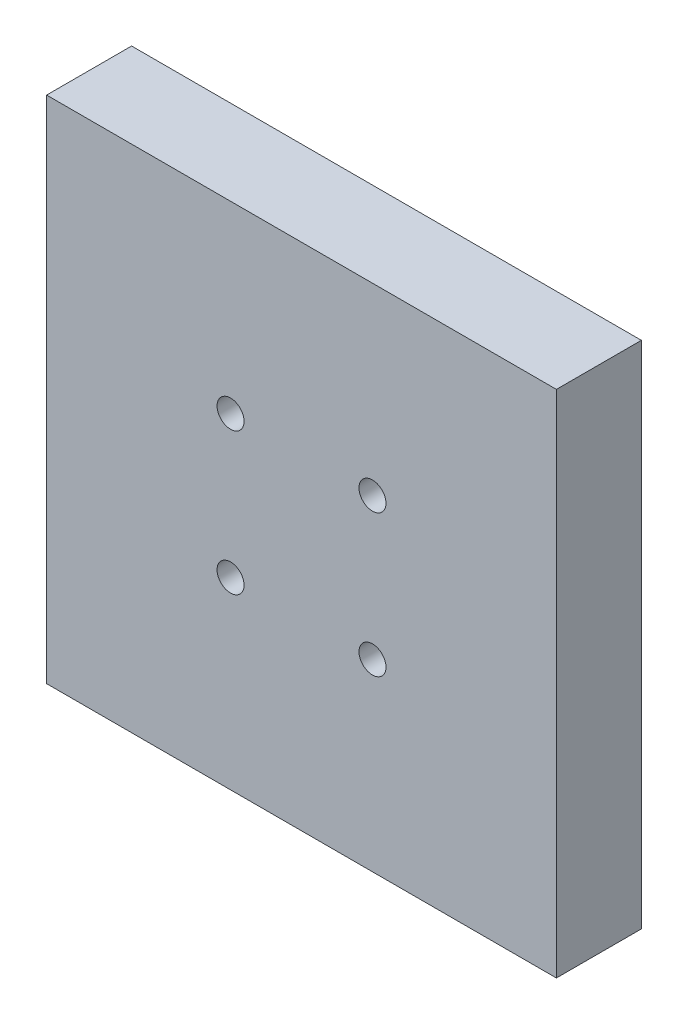
ISO-10303-21;
HEADER;
FILE_DESCRIPTION(('STEP AP214'),'2;1');
FILE_NAME('part.step','',(''),(''),'','','');
FILE_SCHEMA(('AUTOMOTIVE_DESIGN { 1 0 10303 214 1 1 1 1 }'));
ENDSEC;
DATA;
#1=APPLICATION_CONTEXT('core data for automotive mechanical design processes');
#2=APPLICATION_PROTOCOL_DEFINITION('international standard','automotive_design',2000,#1);
#3=PRODUCT_CONTEXT('',#1,'mechanical');
#4=PRODUCT('Part','Part','',(#3));
#5=PRODUCT_RELATED_PRODUCT_CATEGORY('part','',(#4));
#6=PRODUCT_DEFINITION_FORMATION('','',#4);
#7=PRODUCT_DEFINITION_CONTEXT('part definition',#1,'design');
#8=PRODUCT_DEFINITION('design','',#6,#7);
#9=PRODUCT_DEFINITION_SHAPE('','',#8);
#10=(LENGTH_UNIT() NAMED_UNIT(*) SI_UNIT(.MILLI.,.METRE.));
#11=(NAMED_UNIT(*) PLANE_ANGLE_UNIT() SI_UNIT($,.RADIAN.));
#12=(NAMED_UNIT(*) SI_UNIT($,.STERADIAN.) SOLID_ANGLE_UNIT());
#13=UNCERTAINTY_MEASURE_WITH_UNIT(LENGTH_MEASURE(1.E-05),#10,'distance_accuracy_value','');
#14=(GEOMETRIC_REPRESENTATION_CONTEXT(3) GLOBAL_UNCERTAINTY_ASSIGNED_CONTEXT((#13)) GLOBAL_UNIT_ASSIGNED_CONTEXT((#10,
#11,#12)) REPRESENTATION_CONTEXT('',''));
#15=CARTESIAN_POINT('',(0.,0.,0.));
#16=DIRECTION('',(0.,0.,1.));
#17=DIRECTION('',(1.,0.,0.));
#18=AXIS2_PLACEMENT_3D('',#15,#16,#17);
#19=CARTESIAN_POINT('',(0.,0.,12.7));
#20=DIRECTION('',(0.,0.,1.));
#21=DIRECTION('',(1.,0.,0.));
#22=AXIS2_PLACEMENT_3D('',#19,#20,#21);
#23=PLANE('',#22);
#24=CARTESIAN_POINT('',(10.6066017177982,-10.6066017177982,12.7));
#25=DIRECTION('',(0.,0.,-1.));
#26=DIRECTION('',(-1.,0.,0.));
#27=AXIS2_PLACEMENT_3D('',#24,#25,#26);
#28=CIRCLE('',#27,2.0193);
#29=CARTESIAN_POINT('',(8.58730171779821,-10.6066017177982,12.7));
#30=VERTEX_POINT('',#29);
#31=EDGE_CURVE('E147',#30,#30,#28,.T.);
#32=ORIENTED_EDGE('',*,*,#31,.T.);
#33=EDGE_LOOP('',(#32));
#34=FACE_BOUND('',#33,.T.);
#35=CARTESIAN_POINT('',(-10.6066017177982,10.6066017177982,12.7));
#36=DIRECTION('',(0.,0.,-1.));
#37=DIRECTION('',(-1.,0.,0.));
#38=AXIS2_PLACEMENT_3D('',#35,#36,#37);
#39=CIRCLE('',#38,2.0193);
#40=CARTESIAN_POINT('',(-12.6259017177982,10.6066017177982,12.7));
#41=VERTEX_POINT('',#40);
#42=EDGE_CURVE('E127',#41,#41,#39,.T.);
#43=ORIENTED_EDGE('',*,*,#42,.T.);
#44=EDGE_LOOP('',(#43));
#45=FACE_BOUND('',#44,.T.);
#46=DIRECTION('',(1.,0.,0.));
#47=VECTOR('',#46,1.);
#48=CARTESIAN_POINT('',(0.,-38.1,12.7));
#49=LINE('',#48,#47);
#50=CARTESIAN_POINT('',(-38.1,-38.1,12.7));
#51=VERTEX_POINT('',#50);
#52=CARTESIAN_POINT('',(38.1,-38.1,12.7));
#53=VERTEX_POINT('',#52);
#54=EDGE_CURVE('E90',#51,#53,#49,.T.);
#55=ORIENTED_EDGE('',*,*,#54,.T.);
#56=DIRECTION('',(0.,1.,0.));
#57=VECTOR('',#56,1.);
#58=CARTESIAN_POINT('',(38.1,0.,12.7));
#59=LINE('',#58,#57);
#60=CARTESIAN_POINT('',(38.1,38.1,12.7));
#61=VERTEX_POINT('',#60);
#62=EDGE_CURVE('E82',#53,#61,#59,.T.);
#63=ORIENTED_EDGE('',*,*,#62,.T.);
#64=DIRECTION('',(1.,0.,0.));
#65=VECTOR('',#64,1.);
#66=CARTESIAN_POINT('',(0.,38.1,12.7));
#67=LINE('',#66,#65);
#68=CARTESIAN_POINT('',(-38.1,38.1,12.7));
#69=VERTEX_POINT('',#68);
#70=EDGE_CURVE('E89',#69,#61,#67,.T.);
#71=ORIENTED_EDGE('',*,*,#70,.F.);
#72=DIRECTION('',(0.,1.,0.));
#73=VECTOR('',#72,1.);
#74=CARTESIAN_POINT('',(-38.1,0.,12.7));
#75=LINE('',#74,#73);
#76=EDGE_CURVE('E102',#51,#69,#75,.T.);
#77=ORIENTED_EDGE('',*,*,#76,.F.);
#78=EDGE_LOOP('',(#55,#63,#71,#77));
#79=FACE_BOUND('',#78,.T.);
#80=CARTESIAN_POINT('',(10.6066017177982,10.6066017177982,12.7));
#81=DIRECTION('',(0.,0.,1.));
#82=DIRECTION('',(1.,0.,0.));
#83=AXIS2_PLACEMENT_3D('',#80,#81,#82);
#84=CIRCLE('',#83,2.0193);
#85=CARTESIAN_POINT('',(12.6259017177982,10.6066017177982,12.7));
#86=VERTEX_POINT('',#85);
#87=EDGE_CURVE('E131',#86,#86,#84,.T.);
#88=ORIENTED_EDGE('',*,*,#87,.F.);
#89=EDGE_LOOP('',(#88));
#90=FACE_BOUND('',#89,.T.);
#91=CARTESIAN_POINT('',(-10.6066017177982,-10.6066017177982,12.7));
#92=DIRECTION('',(0.,0.,1.));
#93=DIRECTION('',(1.,0.,0.));
#94=AXIS2_PLACEMENT_3D('',#91,#92,#93);
#95=CIRCLE('',#94,2.0193);
#96=CARTESIAN_POINT('',(-8.58730171779822,-10.6066017177982,12.7));
#97=VERTEX_POINT('',#96);
#98=EDGE_CURVE('E139',#97,#97,#95,.T.);
#99=ORIENTED_EDGE('',*,*,#98,.F.);
#100=EDGE_LOOP('',(#99));
#101=FACE_BOUND('',#100,.T.);
#102=ADVANCED_FACE('F39',(#34,#45,#79,#90,#101),#23,.T.);
#103=CARTESIAN_POINT('',(0.,0.,0.));
#104=DIRECTION('',(0.,0.,1.));
#105=DIRECTION('',(1.,0.,0.));
#106=AXIS2_PLACEMENT_3D('',#103,#104,#105);
#107=PLANE('',#106);
#108=CARTESIAN_POINT('',(10.6066017177982,10.6066017177982,0.));
#109=DIRECTION('',(0.,0.,1.));
#110=DIRECTION('',(1.,0.,0.));
#111=AXIS2_PLACEMENT_3D('',#108,#109,#110);
#112=CIRCLE('',#111,2.0193);
#113=CARTESIAN_POINT('',(12.6259017177982,10.6066017177982,0.));
#114=VERTEX_POINT('',#113);
#115=EDGE_CURVE('E151',#114,#114,#112,.T.);
#116=ORIENTED_EDGE('',*,*,#115,.T.);
#117=EDGE_LOOP('',(#116));
#118=FACE_BOUND('',#117,.T.);
#119=CARTESIAN_POINT('',(-10.6066017177982,10.6066017177982,0.));
#120=DIRECTION('',(0.,0.,-1.));
#121=DIRECTION('',(-1.,0.,0.));
#122=AXIS2_PLACEMENT_3D('',#119,#120,#121);
#123=CIRCLE('',#122,2.0193);
#124=CARTESIAN_POINT('',(-12.6259017177982,10.6066017177982,0.));
#125=VERTEX_POINT('',#124);
#126=EDGE_CURVE('E111',#125,#125,#123,.T.);
#127=ORIENTED_EDGE('',*,*,#126,.F.);
#128=EDGE_LOOP('',(#127));
#129=FACE_BOUND('',#128,.T.);
#130=DIRECTION('',(1.,0.,0.));
#131=VECTOR('',#130,1.);
#132=CARTESIAN_POINT('',(0.,-38.1,0.));
#133=LINE('',#132,#131);
#134=CARTESIAN_POINT('',(-38.1,-38.1,0.));
#135=VERTEX_POINT('',#134);
#136=CARTESIAN_POINT('',(38.1,-38.1,0.));
#137=VERTEX_POINT('',#136);
#138=EDGE_CURVE('E108',#135,#137,#133,.T.);
#139=ORIENTED_EDGE('',*,*,#138,.F.);
#140=DIRECTION('',(0.,1.,0.));
#141=VECTOR('',#140,1.);
#142=CARTESIAN_POINT('',(-38.1,0.,0.));
#143=LINE('',#142,#141);
#144=CARTESIAN_POINT('',(-38.1,38.1,0.));
#145=VERTEX_POINT('',#144);
#146=EDGE_CURVE('E117',#135,#145,#143,.T.);
#147=ORIENTED_EDGE('',*,*,#146,.T.);
#148=DIRECTION('',(1.,0.,0.));
#149=VECTOR('',#148,1.);
#150=CARTESIAN_POINT('',(0.,38.1,0.));
#151=LINE('',#150,#149);
#152=CARTESIAN_POINT('',(38.1,38.1,0.));
#153=VERTEX_POINT('',#152);
#154=EDGE_CURVE('E114',#145,#153,#151,.T.);
#155=ORIENTED_EDGE('',*,*,#154,.T.);
#156=DIRECTION('',(0.,1.,0.));
#157=VECTOR('',#156,1.);
#158=CARTESIAN_POINT('',(38.1,0.,0.));
#159=LINE('',#158,#157);
#160=EDGE_CURVE('E96',#137,#153,#159,.T.);
#161=ORIENTED_EDGE('',*,*,#160,.F.);
#162=EDGE_LOOP('',(#139,#147,#155,#161));
#163=FACE_BOUND('',#162,.T.);
#164=CARTESIAN_POINT('',(10.6066017177982,-10.6066017177982,0.));
#165=DIRECTION('',(0.,0.,-1.));
#166=DIRECTION('',(-1.,0.,0.));
#167=AXIS2_PLACEMENT_3D('',#164,#165,#166);
#168=CIRCLE('',#167,2.0193);
#169=CARTESIAN_POINT('',(8.58730171779821,-10.6066017177982,0.));
#170=VERTEX_POINT('',#169);
#171=EDGE_CURVE('E143',#170,#170,#168,.T.);
#172=ORIENTED_EDGE('',*,*,#171,.F.);
#173=EDGE_LOOP('',(#172));
#174=FACE_BOUND('',#173,.T.);
#175=CARTESIAN_POINT('',(-10.6066017177982,-10.6066017177982,0.));
#176=DIRECTION('',(0.,0.,1.));
#177=DIRECTION('',(1.,0.,0.));
#178=AXIS2_PLACEMENT_3D('',#175,#176,#177);
#179=CIRCLE('',#178,2.0193);
#180=CARTESIAN_POINT('',(-8.58730171779822,-10.6066017177982,0.));
#181=VERTEX_POINT('',#180);
#182=EDGE_CURVE('E135',#181,#181,#179,.T.);
#183=ORIENTED_EDGE('',*,*,#182,.T.);
#184=EDGE_LOOP('',(#183));
#185=FACE_BOUND('',#184,.T.);
#186=ADVANCED_FACE('F162',(#118,#129,#163,#174,#185),#107,.F.);
#187=CARTESIAN_POINT('',(0.,-38.1,12.7));
#188=DIRECTION('',(0.,1.,0.));
#189=DIRECTION('',(0.,0.,1.));
#190=AXIS2_PLACEMENT_3D('',#187,#188,#189);
#191=PLANE('',#190);
#192=ORIENTED_EDGE('',*,*,#138,.T.);
#193=DIRECTION('',(0.,0.,-1.));
#194=VECTOR('',#193,1.);
#195=CARTESIAN_POINT('',(38.1,-38.1,12.7));
#196=LINE('',#195,#194);
#197=EDGE_CURVE('E11',#53,#137,#196,.T.);
#198=ORIENTED_EDGE('',*,*,#197,.F.);
#199=ORIENTED_EDGE('',*,*,#54,.F.);
#200=DIRECTION('',(0.,0.,-1.));
#201=VECTOR('',#200,1.);
#202=CARTESIAN_POINT('',(-38.1,-38.1,12.7));
#203=LINE('',#202,#201);
#204=EDGE_CURVE('E57',#51,#135,#203,.T.);
#205=ORIENTED_EDGE('',*,*,#204,.T.);
#206=EDGE_LOOP('',(#192,#198,#199,#205));
#207=FACE_BOUND('',#206,.T.);
#208=ADVANCED_FACE('F41',(#207),#191,.F.);
#209=CARTESIAN_POINT('',(38.1,0.,12.7));
#210=DIRECTION('',(-1.,0.,0.));
#211=DIRECTION('',(0.,0.,1.));
#212=AXIS2_PLACEMENT_3D('',#209,#210,#211);
#213=PLANE('',#212);
#214=ORIENTED_EDGE('',*,*,#160,.T.);
#215=DIRECTION('',(0.,0.,-1.));
#216=VECTOR('',#215,1.);
#217=CARTESIAN_POINT('',(38.1,38.1,12.7));
#218=LINE('',#217,#216);
#219=EDGE_CURVE('E49',#61,#153,#218,.T.);
#220=ORIENTED_EDGE('',*,*,#219,.F.);
#221=ORIENTED_EDGE('',*,*,#62,.F.);
#222=ORIENTED_EDGE('',*,*,#197,.T.);
#223=EDGE_LOOP('',(#214,#220,#221,#222));
#224=FACE_BOUND('',#223,.T.);
#225=ADVANCED_FACE('F95',(#224),#213,.F.);
#226=CARTESIAN_POINT('',(0.,38.1,12.7));
#227=DIRECTION('',(0.,1.,0.));
#228=DIRECTION('',(0.,0.,1.));
#229=AXIS2_PLACEMENT_3D('',#226,#227,#228);
#230=PLANE('',#229);
#231=ORIENTED_EDGE('',*,*,#154,.F.);
#232=DIRECTION('',(0.,0.,-1.));
#233=VECTOR('',#232,1.);
#234=CARTESIAN_POINT('',(-38.1,38.1,12.7));
#235=LINE('',#234,#233);
#236=EDGE_CURVE('E71',#69,#145,#235,.T.);
#237=ORIENTED_EDGE('',*,*,#236,.F.);
#238=ORIENTED_EDGE('',*,*,#70,.T.);
#239=ORIENTED_EDGE('',*,*,#219,.T.);
#240=EDGE_LOOP('',(#231,#237,#238,#239));
#241=FACE_BOUND('',#240,.T.);
#242=ADVANCED_FACE('F100',(#241),#230,.T.);
#243=CARTESIAN_POINT('',(-38.1,0.,12.7));
#244=DIRECTION('',(-1.,0.,0.));
#245=DIRECTION('',(0.,0.,1.));
#246=AXIS2_PLACEMENT_3D('',#243,#244,#245);
#247=PLANE('',#246);
#248=ORIENTED_EDGE('',*,*,#146,.F.);
#249=ORIENTED_EDGE('',*,*,#204,.F.);
#250=ORIENTED_EDGE('',*,*,#76,.T.);
#251=ORIENTED_EDGE('',*,*,#236,.T.);
#252=EDGE_LOOP('',(#248,#249,#250,#251));
#253=FACE_BOUND('',#252,.T.);
#254=ADVANCED_FACE('F182',(#253),#247,.T.);
#255=CARTESIAN_POINT('',(-10.6066017177982,10.6066017177982,0.));
#256=DIRECTION('',(0.,0.,1.));
#257=DIRECTION('',(1.,0.,0.));
#258=AXIS2_PLACEMENT_3D('',#255,#256,#257);
#259=CYLINDRICAL_SURFACE('',#258,2.0193);
#260=ORIENTED_EDGE('',*,*,#126,.T.);
#261=EDGE_LOOP('',(#260));
#262=FACE_BOUND('',#261,.T.);
#263=ORIENTED_EDGE('',*,*,#42,.F.);
#264=EDGE_LOOP('',(#263));
#265=FACE_BOUND('',#264,.T.);
#266=ADVANCED_FACE('F180',(#262,#265),#259,.F.);
#267=CARTESIAN_POINT('',(10.6066017177982,10.6066017177982,0.));
#268=DIRECTION('',(0.,0.,1.));
#269=DIRECTION('',(1.,0.,0.));
#270=AXIS2_PLACEMENT_3D('',#267,#268,#269);
#271=CYLINDRICAL_SURFACE('',#270,2.0193);
#272=ORIENTED_EDGE('',*,*,#115,.F.);
#273=EDGE_LOOP('',(#272));
#274=FACE_BOUND('',#273,.T.);
#275=ORIENTED_EDGE('',*,*,#87,.T.);
#276=EDGE_LOOP('',(#275));
#277=FACE_BOUND('',#276,.T.);
#278=ADVANCED_FACE('F159',(#274,#277),#271,.F.);
#279=CARTESIAN_POINT('',(10.6066017177982,-10.6066017177982,0.));
#280=DIRECTION('',(0.,0.,1.));
#281=DIRECTION('',(1.,0.,0.));
#282=AXIS2_PLACEMENT_3D('',#279,#280,#281);
#283=CYLINDRICAL_SURFACE('',#282,2.0193);
#284=ORIENTED_EDGE('',*,*,#171,.T.);
#285=EDGE_LOOP('',(#284));
#286=FACE_BOUND('',#285,.T.);
#287=ORIENTED_EDGE('',*,*,#31,.F.);
#288=EDGE_LOOP('',(#287));
#289=FACE_BOUND('',#288,.T.);
#290=ADVANCED_FACE('F169',(#286,#289),#283,.F.);
#291=CARTESIAN_POINT('',(-10.6066017177982,-10.6066017177982,0.));
#292=DIRECTION('',(0.,0.,1.));
#293=DIRECTION('',(1.,0.,0.));
#294=AXIS2_PLACEMENT_3D('',#291,#292,#293);
#295=CYLINDRICAL_SURFACE('',#294,2.0193);
#296=ORIENTED_EDGE('',*,*,#182,.F.);
#297=EDGE_LOOP('',(#296));
#298=FACE_BOUND('',#297,.T.);
#299=ORIENTED_EDGE('',*,*,#98,.T.);
#300=EDGE_LOOP('',(#299));
#301=FACE_BOUND('',#300,.T.);
#302=ADVANCED_FACE('F167',(#298,#301),#295,.F.);
#303=CLOSED_SHELL('',(#102,#186,#208,#225,#242,#254,#266,#278,#290,#302));
#304=MANIFOLD_SOLID_BREP('B2',#303);
#305=ADVANCED_BREP_SHAPE_REPRESENTATION('',(#18,#304),#14);
#306=SHAPE_DEFINITION_REPRESENTATION(#9,#305);
ENDSEC;
END-ISO-10303-21;
